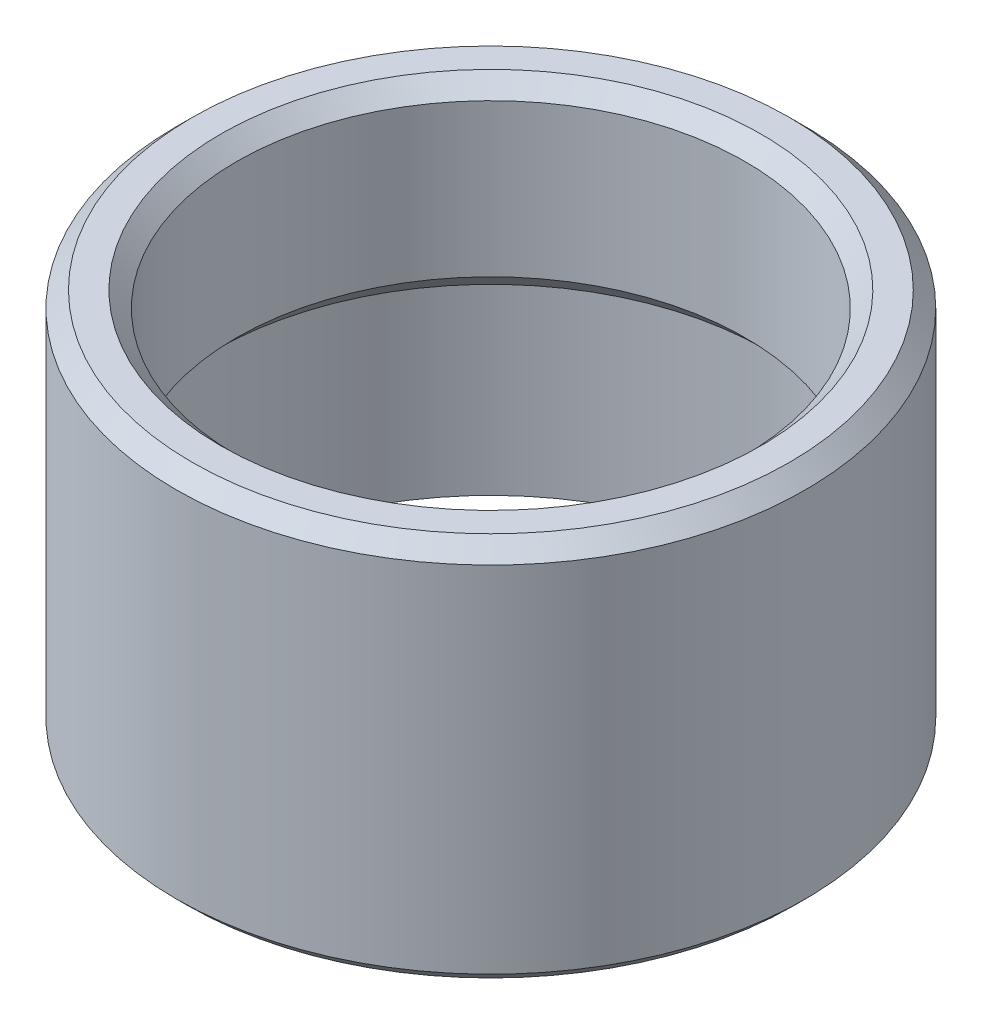
ISO-10303-21;
HEADER;
FILE_DESCRIPTION(('STEP AP214'),'2;1');
FILE_NAME('part.step','',(''),(''),'','','');
FILE_SCHEMA(('AUTOMOTIVE_DESIGN { 1 0 10303 214 1 1 1 1 }'));
ENDSEC;
DATA;
#1=APPLICATION_CONTEXT('core data for automotive mechanical design processes');
#2=APPLICATION_PROTOCOL_DEFINITION('international standard','automotive_design',2000,#1);
#3=PRODUCT_CONTEXT('',#1,'mechanical');
#4=PRODUCT('Part','Part','',(#3));
#5=PRODUCT_RELATED_PRODUCT_CATEGORY('part','',(#4));
#6=PRODUCT_DEFINITION_FORMATION('','',#4);
#7=PRODUCT_DEFINITION_CONTEXT('part definition',#1,'design');
#8=PRODUCT_DEFINITION('design','',#6,#7);
#9=PRODUCT_DEFINITION_SHAPE('','',#8);
#10=(LENGTH_UNIT() NAMED_UNIT(*) SI_UNIT(.MILLI.,.METRE.));
#11=(NAMED_UNIT(*) PLANE_ANGLE_UNIT() SI_UNIT($,.RADIAN.));
#12=(NAMED_UNIT(*) SI_UNIT($,.STERADIAN.) SOLID_ANGLE_UNIT());
#13=UNCERTAINTY_MEASURE_WITH_UNIT(LENGTH_MEASURE(1.E-05),#10,'distance_accuracy_value','');
#14=(GEOMETRIC_REPRESENTATION_CONTEXT(3) GLOBAL_UNCERTAINTY_ASSIGNED_CONTEXT((#13)) GLOBAL_UNIT_ASSIGNED_CONTEXT((#10,
#11,#12)) REPRESENTATION_CONTEXT('',''));
#15=CARTESIAN_POINT('',(0.,0.,0.));
#16=DIRECTION('',(0.,0.,1.));
#17=DIRECTION('',(1.,0.,0.));
#18=AXIS2_PLACEMENT_3D('',#15,#16,#17);
#19=CARTESIAN_POINT('',(0.,0.1749999999811,0.));
#20=DIRECTION('',(0.,1.,0.));
#21=DIRECTION('',(0.,0.,-1.));
#22=AXIS2_PLACEMENT_3D('',#19,#20,#21);
#23=CONICAL_SURFACE('',#22,9.724999999981,0.785398163397448);
#24=CARTESIAN_POINT('',(0.,0.35,0.));
#25=DIRECTION('',(0.,1.,0.));
#26=DIRECTION('',(1.,0.,0.));
#27=AXIS2_PLACEMENT_3D('',#24,#25,#26);
#28=CIRCLE('',#27,9.9);
#29=CARTESIAN_POINT('',(-9.9,0.35,0.));
#30=VERTEX_POINT('',#29);
#31=CARTESIAN_POINT('',(0.,0.350000000000064,9.9));
#32=VERTEX_POINT('',#31);
#33=EDGE_CURVE('E134',#30,#32,#28,.T.);
#34=ORIENTED_EDGE('',*,*,#33,.F.);
#35=CARTESIAN_POINT('',(0.,0.35,0.));
#36=DIRECTION('',(0.,1.,0.));
#37=DIRECTION('',(1.,0.,0.));
#38=AXIS2_PLACEMENT_3D('',#35,#36,#37);
#39=CIRCLE('',#38,9.9);
#40=EDGE_CURVE('E137',#32,#30,#39,.T.);
#41=ORIENTED_EDGE('',*,*,#40,.F.);
#42=DIRECTION('',(0.,-0.707106781186548,-0.707106781186548));
#43=VECTOR('',#42,1.);
#44=CARTESIAN_POINT('',(0.,0.1749999999811,9.72499999998097));
#45=LINE('',#44,#43);
#46=CARTESIAN_POINT('',(0.,0.,9.55));
#47=VERTEX_POINT('',#46);
#48=EDGE_CURVE('E11',#32,#47,#45,.T.);
#49=ORIENTED_EDGE('',*,*,#48,.T.);
#50=CARTESIAN_POINT('',(0.,0.,0.));
#51=DIRECTION('',(0.,1.,0.));
#52=DIRECTION('',(1.,0.,0.));
#53=AXIS2_PLACEMENT_3D('',#50,#51,#52);
#54=CIRCLE('',#53,9.55);
#55=EDGE_CURVE('E28',#47,#47,#54,.T.);
#56=ORIENTED_EDGE('',*,*,#55,.T.);
#57=ORIENTED_EDGE('',*,*,#48,.F.);
#58=EDGE_LOOP('',(#34,#41,#49,#56,#57));
#59=FACE_BOUND('',#58,.T.);
#60=ADVANCED_FACE('F17',(#59),#23,.T.);
#61=CARTESIAN_POINT('',(0.,0.,0.));
#62=DIRECTION('',(0.,1.,0.));
#63=DIRECTION('',(1.,0.,0.));
#64=AXIS2_PLACEMENT_3D('',#61,#62,#63);
#65=PLANE('',#64);
#66=CARTESIAN_POINT('',(0.,0.,0.));
#67=DIRECTION('',(0.,-1.,0.));
#68=DIRECTION('',(1.,0.,0.));
#69=AXIS2_PLACEMENT_3D('',#66,#67,#68);
#70=CIRCLE('',#69,9.05);
#71=CARTESIAN_POINT('',(-9.05,0.,0.));
#72=VERTEX_POINT('',#71);
#73=EDGE_CURVE('E21',#72,#72,#70,.T.);
#74=ORIENTED_EDGE('',*,*,#73,.F.);
#75=EDGE_LOOP('',(#74));
#76=FACE_BOUND('',#75,.T.);
#77=ORIENTED_EDGE('',*,*,#55,.F.);
#78=EDGE_LOOP('',(#77));
#79=FACE_BOUND('',#78,.T.);
#80=ADVANCED_FACE('F162',(#76,#79),#65,.F.);
#81=CARTESIAN_POINT('',(0.,-0.6,0.));
#82=DIRECTION('',(0.,1.,0.));
#83=DIRECTION('',(1.,0.,0.));
#84=AXIS2_PLACEMENT_3D('',#81,#82,#83);
#85=CYLINDRICAL_SURFACE('',#84,9.05);
#86=ORIENTED_EDGE('',*,*,#73,.T.);
#87=DIRECTION('',(0.,1.,0.));
#88=VECTOR('',#87,1.);
#89=CARTESIAN_POINT('',(-9.05,-0.6,0.));
#90=LINE('',#89,#88);
#91=CARTESIAN_POINT('',(-9.05,6.,0.));
#92=VERTEX_POINT('',#91);
#93=EDGE_CURVE('E154',#72,#92,#90,.T.);
#94=ORIENTED_EDGE('',*,*,#93,.T.);
#95=CARTESIAN_POINT('',(0.,6.,0.));
#96=DIRECTION('',(0.,-1.,0.));
#97=DIRECTION('',(1.,0.,0.));
#98=AXIS2_PLACEMENT_3D('',#95,#96,#97);
#99=CIRCLE('',#98,9.05);
#100=EDGE_CURVE('E124',#92,#92,#99,.T.);
#101=ORIENTED_EDGE('',*,*,#100,.F.);
#102=ORIENTED_EDGE('',*,*,#93,.F.);
#103=EDGE_LOOP('',(#86,#94,#101,#102));
#104=FACE_BOUND('',#103,.T.);
#105=ADVANCED_FACE('F164',(#104),#85,.F.);
#106=CARTESIAN_POINT('',(0.,6.,0.));
#107=DIRECTION('',(0.,1.,0.));
#108=DIRECTION('',(1.,0.,0.));
#109=AXIS2_PLACEMENT_3D('',#106,#107,#108);
#110=PLANE('',#109);
#111=CARTESIAN_POINT('',(0.,6.,0.));
#112=DIRECTION('',(0.,1.,0.));
#113=DIRECTION('',(1.,0.,0.));
#114=AXIS2_PLACEMENT_3D('',#111,#112,#113);
#115=CIRCLE('',#114,8.7);
#116=CARTESIAN_POINT('',(0.,6.,8.7));
#117=VERTEX_POINT('',#116);
#118=EDGE_CURVE('E120',#117,#117,#115,.T.);
#119=ORIENTED_EDGE('',*,*,#118,.T.);
#120=EDGE_LOOP('',(#119));
#121=FACE_BOUND('',#120,.T.);
#122=ORIENTED_EDGE('',*,*,#100,.T.);
#123=EDGE_LOOP('',(#122));
#124=FACE_BOUND('',#123,.T.);
#125=ADVANCED_FACE('F172',(#121,#124),#110,.F.);
#126=CARTESIAN_POINT('',(0.,6.350000000084,0.));
#127=DIRECTION('',(0.,-1.,0.));
#128=DIRECTION('',(0.,0.,-1.));
#129=AXIS2_PLACEMENT_3D('',#126,#127,#128);
#130=CONICAL_SURFACE('',#129,8.349999999916,0.785398163397448);
#131=CARTESIAN_POINT('',(0.,6.7,0.));
#132=DIRECTION('',(0.,1.,0.));
#133=DIRECTION('',(1.,0.,0.));
#134=AXIS2_PLACEMENT_3D('',#131,#132,#133);
#135=CIRCLE('',#134,8.);
#136=CARTESIAN_POINT('',(-8.,6.7,0.));
#137=VERTEX_POINT('',#136);
#138=CARTESIAN_POINT('',(0.,6.7,8.));
#139=VERTEX_POINT('',#138);
#140=EDGE_CURVE('E125',#137,#139,#135,.T.);
#141=ORIENTED_EDGE('',*,*,#140,.T.);
#142=DIRECTION('',(0.,-0.707106781186548,0.707106781186548));
#143=VECTOR('',#142,1.);
#144=CARTESIAN_POINT('',(0.,6.350000000084,8.349999999916));
#145=LINE('',#144,#143);
#146=EDGE_CURVE('E116',#139,#117,#145,.T.);
#147=ORIENTED_EDGE('',*,*,#146,.T.);
#148=ORIENTED_EDGE('',*,*,#118,.F.);
#149=ORIENTED_EDGE('',*,*,#146,.F.);
#150=CARTESIAN_POINT('',(0.,6.7,0.));
#151=DIRECTION('',(0.,1.,0.));
#152=DIRECTION('',(1.,0.,0.));
#153=AXIS2_PLACEMENT_3D('',#150,#151,#152);
#154=CIRCLE('',#153,8.);
#155=EDGE_CURVE('E121',#139,#137,#154,.T.);
#156=ORIENTED_EDGE('',*,*,#155,.T.);
#157=EDGE_LOOP('',(#141,#147,#148,#149,#156));
#158=FACE_BOUND('',#157,.T.);
#159=ADVANCED_FACE('F19',(#158),#130,.F.);
#160=CARTESIAN_POINT('',(0.,-0.6,0.));
#161=DIRECTION('',(0.,1.,0.));
#162=DIRECTION('',(1.,0.,0.));
#163=AXIS2_PLACEMENT_3D('',#160,#161,#162);
#164=CYLINDRICAL_SURFACE('',#163,8.);
#165=ORIENTED_EDGE('',*,*,#140,.F.);
#166=DIRECTION('',(0.,1.,0.));
#167=VECTOR('',#166,1.);
#168=CARTESIAN_POINT('',(-8.,-0.6,0.));
#169=LINE('',#168,#167);
#170=CARTESIAN_POINT('',(-7.999999999955,11.49999999995,-4.405075524221E-10));
#171=VERTEX_POINT('',#170);
#172=EDGE_CURVE('E128',#137,#171,#169,.T.);
#173=ORIENTED_EDGE('',*,*,#172,.T.);
#174=CARTESIAN_POINT('',(0.,11.5,0.));
#175=DIRECTION('',(0.,1.,0.));
#176=DIRECTION('',(-1.,0.,0.));
#177=AXIS2_PLACEMENT_3D('',#174,#175,#176);
#178=CIRCLE('',#177,8.);
#179=CARTESIAN_POINT('',(0.,11.4999999999995,8.0000000000005));
#180=VERTEX_POINT('',#179);
#181=EDGE_CURVE('E107',#171,#180,#178,.T.);
#182=ORIENTED_EDGE('',*,*,#181,.T.);
#183=CARTESIAN_POINT('',(0.,11.5,0.));
#184=DIRECTION('',(0.,1.,0.));
#185=DIRECTION('',(-1.,0.,0.));
#186=AXIS2_PLACEMENT_3D('',#183,#184,#185);
#187=CIRCLE('',#186,8.);
#188=EDGE_CURVE('E115',#180,#171,#187,.T.);
#189=ORIENTED_EDGE('',*,*,#188,.T.);
#190=ORIENTED_EDGE('',*,*,#172,.F.);
#191=ORIENTED_EDGE('',*,*,#155,.F.);
#192=EDGE_LOOP('',(#165,#173,#182,#189,#190,#191));
#193=FACE_BOUND('',#192,.T.);
#194=ADVANCED_FACE('F188',(#193),#164,.F.);
#195=CARTESIAN_POINT('',(0.,11.74999999995,0.));
#196=DIRECTION('',(0.,1.,0.));
#197=DIRECTION('',(0.,0.,-1.));
#198=AXIS2_PLACEMENT_3D('',#195,#196,#197);
#199=CONICAL_SURFACE('',#198,8.249999999951,0.785398163397448);
#200=ORIENTED_EDGE('',*,*,#181,.F.);
#201=ORIENTED_EDGE('',*,*,#188,.F.);
#202=DIRECTION('',(0.,0.707106781186548,0.707106781186548));
#203=VECTOR('',#202,1.);
#204=CARTESIAN_POINT('',(0.,11.74999999995,8.249999999951));
#205=LINE('',#204,#203);
#206=CARTESIAN_POINT('',(0.,11.9999999999995,8.5000000000005));
#207=VERTEX_POINT('',#206);
#208=EDGE_CURVE('E129',#180,#207,#205,.T.);
#209=ORIENTED_EDGE('',*,*,#208,.T.);
#210=CARTESIAN_POINT('',(0.,12.,0.));
#211=DIRECTION('',(0.,1.,0.));
#212=DIRECTION('',(-1.,0.,0.));
#213=AXIS2_PLACEMENT_3D('',#210,#211,#212);
#214=CIRCLE('',#213,8.5);
#215=EDGE_CURVE('E99',#207,#207,#214,.T.);
#216=ORIENTED_EDGE('',*,*,#215,.T.);
#217=ORIENTED_EDGE('',*,*,#208,.F.);
#218=EDGE_LOOP('',(#200,#201,#209,#216,#217));
#219=FACE_BOUND('',#218,.T.);
#220=ADVANCED_FACE('F190',(#219),#199,.F.);
#221=CARTESIAN_POINT('',(0.,12.,0.));
#222=DIRECTION('',(0.,1.,0.));
#223=DIRECTION('',(1.,0.,0.));
#224=AXIS2_PLACEMENT_3D('',#221,#222,#223);
#225=PLANE('',#224);
#226=ORIENTED_EDGE('',*,*,#215,.F.);
#227=EDGE_LOOP('',(#226));
#228=FACE_BOUND('',#227,.T.);
#229=CARTESIAN_POINT('',(0.,12.,0.));
#230=DIRECTION('',(0.,1.,0.));
#231=DIRECTION('',(1.,0.,0.));
#232=AXIS2_PLACEMENT_3D('',#229,#230,#231);
#233=CIRCLE('',#232,9.4);
#234=CARTESIAN_POINT('',(0.,12.000000000001,9.40000000000098));
#235=VERTEX_POINT('',#234);
#236=EDGE_CURVE('E96',#235,#235,#233,.T.);
#237=ORIENTED_EDGE('',*,*,#236,.T.);
#238=EDGE_LOOP('',(#237));
#239=FACE_BOUND('',#238,.T.);
#240=ADVANCED_FACE('F97',(#228,#239),#225,.T.);
#241=CARTESIAN_POINT('',(0.,11.75000000003,0.));
#242=DIRECTION('',(0.,-1.,0.));
#243=DIRECTION('',(0.,0.,-1.));
#244=AXIS2_PLACEMENT_3D('',#241,#242,#243);
#245=CONICAL_SURFACE('',#244,9.649999999972,0.785398163397448);
#246=CARTESIAN_POINT('',(0.,11.5,0.));
#247=DIRECTION('',(0.,1.,0.));
#248=DIRECTION('',(1.,0.,0.));
#249=AXIS2_PLACEMENT_3D('',#246,#247,#248);
#250=CIRCLE('',#249,9.9);
#251=CARTESIAN_POINT('',(-9.899999999977,11.50000000002,9.019253438931E-10));
#252=VERTEX_POINT('',#251);
#253=CARTESIAN_POINT('',(0.,11.500000000001,9.90000000000099));
#254=VERTEX_POINT('',#253);
#255=EDGE_CURVE('E131',#252,#254,#250,.T.);
#256=ORIENTED_EDGE('',*,*,#255,.T.);
#257=DIRECTION('',(0.,0.707106781186548,-0.707106781186548));
#258=VECTOR('',#257,1.);
#259=CARTESIAN_POINT('',(0.,11.75000000003,9.64999999997198));
#260=LINE('',#259,#258);
#261=EDGE_CURVE('E82',#254,#235,#260,.T.);
#262=ORIENTED_EDGE('',*,*,#261,.T.);
#263=ORIENTED_EDGE('',*,*,#236,.F.);
#264=ORIENTED_EDGE('',*,*,#261,.F.);
#265=CARTESIAN_POINT('',(0.,11.5,0.));
#266=DIRECTION('',(0.,1.,0.));
#267=DIRECTION('',(1.,0.,0.));
#268=AXIS2_PLACEMENT_3D('',#265,#266,#267);
#269=CIRCLE('',#268,9.9);
#270=EDGE_CURVE('E90',#254,#252,#269,.T.);
#271=ORIENTED_EDGE('',*,*,#270,.T.);
#272=EDGE_LOOP('',(#256,#262,#263,#264,#271));
#273=FACE_BOUND('',#272,.T.);
#274=ADVANCED_FACE('F182',(#273),#245,.T.);
#275=CARTESIAN_POINT('',(0.,-0.6,0.));
#276=DIRECTION('',(0.,1.,0.));
#277=DIRECTION('',(1.,0.,0.));
#278=AXIS2_PLACEMENT_3D('',#275,#276,#277);
#279=CYLINDRICAL_SURFACE('',#278,9.9);
#280=ORIENTED_EDGE('',*,*,#255,.F.);
#281=DIRECTION('',(0.,-1.,0.));
#282=VECTOR('',#281,1.);
#283=CARTESIAN_POINT('',(-9.9,-0.6,0.));
#284=LINE('',#283,#282);
#285=EDGE_CURVE('E133',#252,#30,#284,.T.);
#286=ORIENTED_EDGE('',*,*,#285,.T.);
#287=ORIENTED_EDGE('',*,*,#33,.T.);
#288=ORIENTED_EDGE('',*,*,#40,.T.);
#289=ORIENTED_EDGE('',*,*,#285,.F.);
#290=ORIENTED_EDGE('',*,*,#270,.F.);
#291=EDGE_LOOP('',(#280,#286,#287,#288,#289,#290));
#292=FACE_BOUND('',#291,.T.);
#293=ADVANCED_FACE('F179',(#292),#279,.T.);
#294=CLOSED_SHELL('',(#60,#80,#105,#125,#159,#194,#220,#240,#274,#293));
#295=MANIFOLD_SOLID_BREP('B1',#294);
#296=ADVANCED_BREP_SHAPE_REPRESENTATION('',(#18,#295),#14);
#297=SHAPE_DEFINITION_REPRESENTATION(#9,#296);
ENDSEC;
END-ISO-10303-21;
